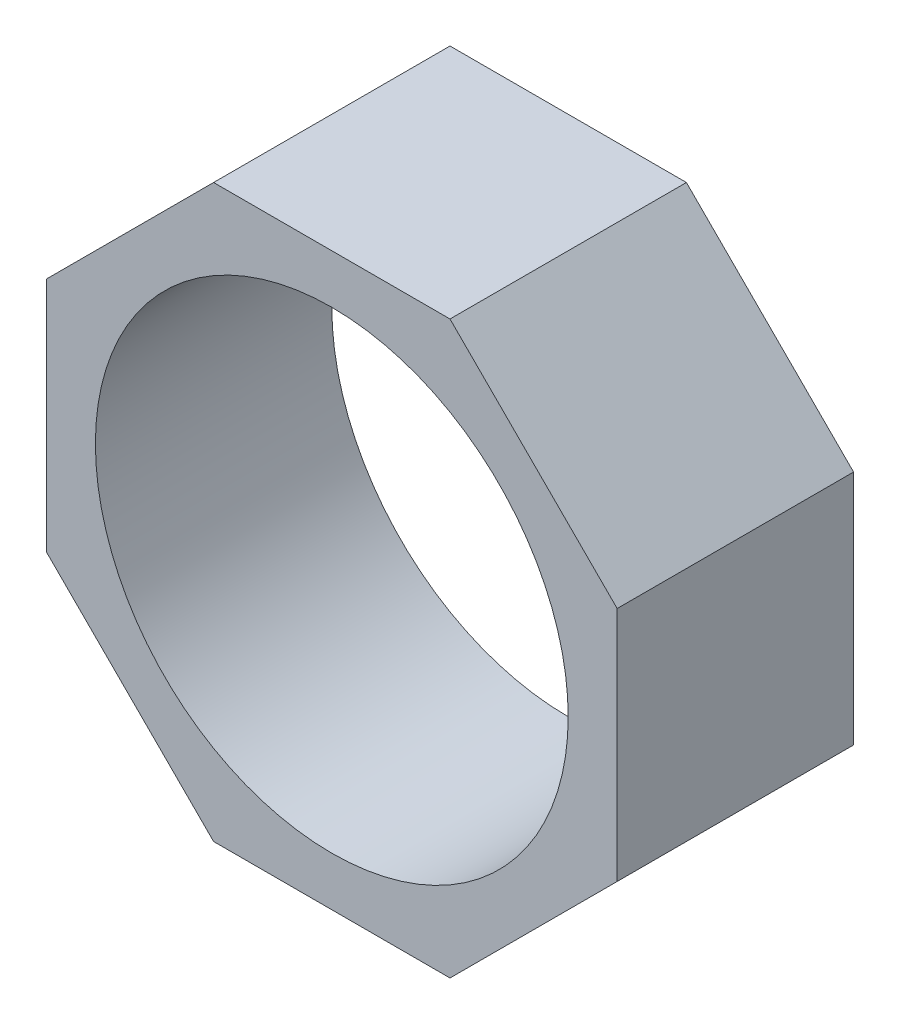
ISO-10303-21;
HEADER;
FILE_DESCRIPTION(('STEP AP214'),'2;1');
FILE_NAME('part.step','',(''),(''),'','','');
FILE_SCHEMA(('AUTOMOTIVE_DESIGN { 1 0 10303 214 1 1 1 1 }'));
ENDSEC;
DATA;
#1=APPLICATION_CONTEXT('core data for automotive mechanical design processes');
#2=APPLICATION_PROTOCOL_DEFINITION('international standard','automotive_design',2000,#1);
#3=PRODUCT_CONTEXT('',#1,'mechanical');
#4=PRODUCT('Part','Part','',(#3));
#5=PRODUCT_RELATED_PRODUCT_CATEGORY('part','',(#4));
#6=PRODUCT_DEFINITION_FORMATION('','',#4);
#7=PRODUCT_DEFINITION_CONTEXT('part definition',#1,'design');
#8=PRODUCT_DEFINITION('design','',#6,#7);
#9=PRODUCT_DEFINITION_SHAPE('','',#8);
#10=(LENGTH_UNIT() NAMED_UNIT(*) SI_UNIT(.MILLI.,.METRE.));
#11=(NAMED_UNIT(*) PLANE_ANGLE_UNIT() SI_UNIT($,.RADIAN.));
#12=(NAMED_UNIT(*) SI_UNIT($,.STERADIAN.) SOLID_ANGLE_UNIT());
#13=UNCERTAINTY_MEASURE_WITH_UNIT(LENGTH_MEASURE(1.E-05),#10,'distance_accuracy_value','');
#14=(GEOMETRIC_REPRESENTATION_CONTEXT(3) GLOBAL_UNCERTAINTY_ASSIGNED_CONTEXT((#13)) GLOBAL_UNIT_ASSIGNED_CONTEXT((#10,
#11,#12)) REPRESENTATION_CONTEXT('',''));
#15=CARTESIAN_POINT('',(0.,0.,0.));
#16=DIRECTION('',(0.,0.,1.));
#17=DIRECTION('',(1.,0.,0.));
#18=AXIS2_PLACEMENT_3D('',#15,#16,#17);
#19=CARTESIAN_POINT('',(0.,0.,2.5));
#20=DIRECTION('',(0.,0.,-1.));
#21=DIRECTION('',(-1.,0.,0.));
#22=AXIS2_PLACEMENT_3D('',#19,#20,#21);
#23=PLANE('',#22);
#24=DIRECTION('',(-0.707106781186548,-0.707106781186547,0.));
#25=VECTOR('',#24,1.);
#26=CARTESIAN_POINT('',(-3.01776695296637,1.25,2.5));
#27=LINE('',#26,#25);
#28=CARTESIAN_POINT('',(-1.25,3.01776695296637,2.5));
#29=VERTEX_POINT('',#28);
#30=CARTESIAN_POINT('',(-3.01776695296637,1.25,2.5));
#31=VERTEX_POINT('',#30);
#32=EDGE_CURVE('E149',#29,#31,#27,.T.);
#33=ORIENTED_EDGE('',*,*,#32,.T.);
#34=DIRECTION('',(0.,-1.,0.));
#35=VECTOR('',#34,1.);
#36=CARTESIAN_POINT('',(-3.01776695296637,-1.25,2.5));
#37=LINE('',#36,#35);
#38=CARTESIAN_POINT('',(-3.01776695296637,-1.25,2.5));
#39=VERTEX_POINT('',#38);
#40=EDGE_CURVE('E97',#31,#39,#37,.T.);
#41=ORIENTED_EDGE('',*,*,#40,.T.);
#42=DIRECTION('',(0.707106781186548,-0.707106781186547,0.));
#43=VECTOR('',#42,1.);
#44=CARTESIAN_POINT('',(-1.25,-3.01776695296637,2.5));
#45=LINE('',#44,#43);
#46=CARTESIAN_POINT('',(-1.25,-3.01776695296637,2.5));
#47=VERTEX_POINT('',#46);
#48=EDGE_CURVE('E164',#39,#47,#45,.T.);
#49=ORIENTED_EDGE('',*,*,#48,.T.);
#50=DIRECTION('',(1.,0.,0.));
#51=VECTOR('',#50,1.);
#52=CARTESIAN_POINT('',(1.25,-3.01776695296637,2.5));
#53=LINE('',#52,#51);
#54=CARTESIAN_POINT('',(1.25,-3.01776695296637,2.5));
#55=VERTEX_POINT('',#54);
#56=EDGE_CURVE('E177',#47,#55,#53,.T.);
#57=ORIENTED_EDGE('',*,*,#56,.T.);
#58=DIRECTION('',(0.707106781186548,0.707106781186547,0.));
#59=VECTOR('',#58,1.);
#60=CARTESIAN_POINT('',(3.01776695296637,-1.25,2.5));
#61=LINE('',#60,#59);
#62=CARTESIAN_POINT('',(3.01776695296637,-1.25,2.5));
#63=VERTEX_POINT('',#62);
#64=EDGE_CURVE('E116',#55,#63,#61,.T.);
#65=ORIENTED_EDGE('',*,*,#64,.T.);
#66=DIRECTION('',(0.,1.,0.));
#67=VECTOR('',#66,1.);
#68=CARTESIAN_POINT('',(3.01776695296637,1.25,2.5));
#69=LINE('',#68,#67);
#70=CARTESIAN_POINT('',(3.01776695296637,1.25,2.5));
#71=VERTEX_POINT('',#70);
#72=EDGE_CURVE('E110',#63,#71,#69,.T.);
#73=ORIENTED_EDGE('',*,*,#72,.T.);
#74=DIRECTION('',(-0.707106781186548,0.707106781186547,0.));
#75=VECTOR('',#74,1.);
#76=CARTESIAN_POINT('',(1.25,3.01776695296637,2.5));
#77=LINE('',#76,#75);
#78=CARTESIAN_POINT('',(1.25,3.01776695296637,2.5));
#79=VERTEX_POINT('',#78);
#80=EDGE_CURVE('E114',#71,#79,#77,.T.);
#81=ORIENTED_EDGE('',*,*,#80,.T.);
#82=DIRECTION('',(-1.,0.,0.));
#83=VECTOR('',#82,1.);
#84=CARTESIAN_POINT('',(-1.25,3.01776695296637,2.5));
#85=LINE('',#84,#83);
#86=EDGE_CURVE('E54',#79,#29,#85,.T.);
#87=ORIENTED_EDGE('',*,*,#86,.T.);
#88=EDGE_LOOP('',(#33,#41,#49,#57,#65,#73,#81,#87));
#89=FACE_BOUND('',#88,.T.);
#90=CARTESIAN_POINT('',(0.,0.,2.5));
#91=DIRECTION('',(0.,0.,1.));
#92=DIRECTION('',(1.,0.,0.));
#93=AXIS2_PLACEMENT_3D('',#90,#91,#92);
#94=CIRCLE('',#93,2.5);
#95=CARTESIAN_POINT('',(2.5,0.,2.5));
#96=VERTEX_POINT('',#95);
#97=EDGE_CURVE('E138',#96,#96,#94,.T.);
#98=ORIENTED_EDGE('',*,*,#97,.F.);
#99=EDGE_LOOP('',(#98));
#100=FACE_BOUND('',#99,.T.);
#101=ADVANCED_FACE('F37',(#89,#100),#23,.F.);
#102=CARTESIAN_POINT('',(0.,0.,0.));
#103=DIRECTION('',(0.,0.,-1.));
#104=DIRECTION('',(-1.,0.,0.));
#105=AXIS2_PLACEMENT_3D('',#102,#103,#104);
#106=PLANE('',#105);
#107=DIRECTION('',(-0.707106781186548,-0.707106781186547,0.));
#108=VECTOR('',#107,1.);
#109=CARTESIAN_POINT('',(-3.01776695296637,1.25,0.));
#110=LINE('',#109,#108);
#111=CARTESIAN_POINT('',(-1.25,3.01776695296637,0.));
#112=VERTEX_POINT('',#111);
#113=CARTESIAN_POINT('',(-3.01776695296637,1.25,0.));
#114=VERTEX_POINT('',#113);
#115=EDGE_CURVE('E134',#112,#114,#110,.T.);
#116=ORIENTED_EDGE('',*,*,#115,.F.);
#117=DIRECTION('',(-1.,0.,0.));
#118=VECTOR('',#117,1.);
#119=CARTESIAN_POINT('',(-1.25,3.01776695296637,0.));
#120=LINE('',#119,#118);
#121=CARTESIAN_POINT('',(1.25,3.01776695296637,0.));
#122=VERTEX_POINT('',#121);
#123=EDGE_CURVE('E89',#122,#112,#120,.T.);
#124=ORIENTED_EDGE('',*,*,#123,.F.);
#125=DIRECTION('',(-0.707106781186548,0.707106781186547,0.));
#126=VECTOR('',#125,1.);
#127=CARTESIAN_POINT('',(1.25,3.01776695296637,0.));
#128=LINE('',#127,#126);
#129=CARTESIAN_POINT('',(3.01776695296637,1.25,0.));
#130=VERTEX_POINT('',#129);
#131=EDGE_CURVE('E83',#130,#122,#128,.T.);
#132=ORIENTED_EDGE('',*,*,#131,.F.);
#133=DIRECTION('',(0.,1.,0.));
#134=VECTOR('',#133,1.);
#135=CARTESIAN_POINT('',(3.01776695296637,1.25,0.));
#136=LINE('',#135,#134);
#137=CARTESIAN_POINT('',(3.01776695296637,-1.25,0.));
#138=VERTEX_POINT('',#137);
#139=EDGE_CURVE('E124',#138,#130,#136,.T.);
#140=ORIENTED_EDGE('',*,*,#139,.F.);
#141=DIRECTION('',(0.707106781186548,0.707106781186547,0.));
#142=VECTOR('',#141,1.);
#143=CARTESIAN_POINT('',(3.01776695296637,-1.25,0.));
#144=LINE('',#143,#142);
#145=CARTESIAN_POINT('',(1.25,-3.01776695296637,0.));
#146=VERTEX_POINT('',#145);
#147=EDGE_CURVE('E144',#146,#138,#144,.T.);
#148=ORIENTED_EDGE('',*,*,#147,.F.);
#149=DIRECTION('',(1.,0.,0.));
#150=VECTOR('',#149,1.);
#151=CARTESIAN_POINT('',(1.25,-3.01776695296637,0.));
#152=LINE('',#151,#150);
#153=CARTESIAN_POINT('',(-1.25,-3.01776695296637,0.));
#154=VERTEX_POINT('',#153);
#155=EDGE_CURVE('E142',#154,#146,#152,.T.);
#156=ORIENTED_EDGE('',*,*,#155,.F.);
#157=DIRECTION('',(0.707106781186548,-0.707106781186547,0.));
#158=VECTOR('',#157,1.);
#159=CARTESIAN_POINT('',(-1.25,-3.01776695296637,0.));
#160=LINE('',#159,#158);
#161=CARTESIAN_POINT('',(-3.01776695296637,-1.25,0.));
#162=VERTEX_POINT('',#161);
#163=EDGE_CURVE('E140',#162,#154,#160,.T.);
#164=ORIENTED_EDGE('',*,*,#163,.F.);
#165=DIRECTION('',(0.,-1.,0.));
#166=VECTOR('',#165,1.);
#167=CARTESIAN_POINT('',(-3.01776695296637,-1.25,0.));
#168=LINE('',#167,#166);
#169=EDGE_CURVE('E137',#114,#162,#168,.T.);
#170=ORIENTED_EDGE('',*,*,#169,.F.);
#171=EDGE_LOOP('',(#116,#124,#132,#140,#148,#156,#164,#170));
#172=FACE_BOUND('',#171,.T.);
#173=CARTESIAN_POINT('',(0.,0.,0.));
#174=DIRECTION('',(0.,0.,1.));
#175=DIRECTION('',(1.,0.,0.));
#176=AXIS2_PLACEMENT_3D('',#173,#174,#175);
#177=CIRCLE('',#176,2.5);
#178=CARTESIAN_POINT('',(2.5,0.,0.));
#179=VERTEX_POINT('',#178);
#180=EDGE_CURVE('E183',#179,#179,#177,.T.);
#181=ORIENTED_EDGE('',*,*,#180,.T.);
#182=EDGE_LOOP('',(#181));
#183=FACE_BOUND('',#182,.T.);
#184=ADVANCED_FACE('F168',(#172,#183),#106,.T.);
#185=CARTESIAN_POINT('',(-3.01776695296637,1.25,2.5));
#186=DIRECTION('',(0.707106781186547,-0.707106781186548,0.));
#187=DIRECTION('',(0.707106781186548,0.707106781186547,0.));
#188=AXIS2_PLACEMENT_3D('',#185,#186,#187);
#189=PLANE('',#188);
#190=ORIENTED_EDGE('',*,*,#115,.T.);
#191=DIRECTION('',(0.,0.,-1.));
#192=VECTOR('',#191,1.);
#193=CARTESIAN_POINT('',(-3.01776695296637,1.25,2.5));
#194=LINE('',#193,#192);
#195=EDGE_CURVE('E11',#31,#114,#194,.T.);
#196=ORIENTED_EDGE('',*,*,#195,.F.);
#197=ORIENTED_EDGE('',*,*,#32,.F.);
#198=DIRECTION('',(0.,0.,-1.));
#199=VECTOR('',#198,1.);
#200=CARTESIAN_POINT('',(-1.25,3.01776695296637,2.5));
#201=LINE('',#200,#199);
#202=EDGE_CURVE('E130',#29,#112,#201,.T.);
#203=ORIENTED_EDGE('',*,*,#202,.T.);
#204=EDGE_LOOP('',(#190,#196,#197,#203));
#205=FACE_BOUND('',#204,.T.);
#206=ADVANCED_FACE('F39',(#205),#189,.F.);
#207=CARTESIAN_POINT('',(-3.01776695296637,-1.25,2.5));
#208=DIRECTION('',(1.,0.,0.));
#209=DIRECTION('',(0.,0.,-1.));
#210=AXIS2_PLACEMENT_3D('',#207,#208,#209);
#211=PLANE('',#210);
#212=ORIENTED_EDGE('',*,*,#169,.T.);
#213=DIRECTION('',(0.,0.,-1.));
#214=VECTOR('',#213,1.);
#215=CARTESIAN_POINT('',(-3.01776695296637,-1.25,2.5));
#216=LINE('',#215,#214);
#217=EDGE_CURVE('E46',#39,#162,#216,.T.);
#218=ORIENTED_EDGE('',*,*,#217,.F.);
#219=ORIENTED_EDGE('',*,*,#40,.F.);
#220=ORIENTED_EDGE('',*,*,#195,.T.);
#221=EDGE_LOOP('',(#212,#218,#219,#220));
#222=FACE_BOUND('',#221,.T.);
#223=ADVANCED_FACE('F211',(#222),#211,.F.);
#224=CARTESIAN_POINT('',(-1.25,-3.01776695296637,2.5));
#225=DIRECTION('',(0.707106781186547,0.707106781186548,0.));
#226=DIRECTION('',(-0.707106781186548,0.707106781186547,0.));
#227=AXIS2_PLACEMENT_3D('',#224,#225,#226);
#228=PLANE('',#227);
#229=ORIENTED_EDGE('',*,*,#163,.T.);
#230=DIRECTION('',(0.,0.,-1.));
#231=VECTOR('',#230,1.);
#232=CARTESIAN_POINT('',(-1.25,-3.01776695296637,2.5));
#233=LINE('',#232,#231);
#234=EDGE_CURVE('E156',#47,#154,#233,.T.);
#235=ORIENTED_EDGE('',*,*,#234,.F.);
#236=ORIENTED_EDGE('',*,*,#48,.F.);
#237=ORIENTED_EDGE('',*,*,#217,.T.);
#238=EDGE_LOOP('',(#229,#235,#236,#237));
#239=FACE_BOUND('',#238,.T.);
#240=ADVANCED_FACE('F162',(#239),#228,.F.);
#241=CARTESIAN_POINT('',(1.25,-3.01776695296637,2.5));
#242=DIRECTION('',(0.,1.,0.));
#243=DIRECTION('',(0.,0.,1.));
#244=AXIS2_PLACEMENT_3D('',#241,#242,#243);
#245=PLANE('',#244);
#246=ORIENTED_EDGE('',*,*,#155,.T.);
#247=DIRECTION('',(0.,0.,-1.));
#248=VECTOR('',#247,1.);
#249=CARTESIAN_POINT('',(1.25,-3.01776695296637,2.5));
#250=LINE('',#249,#248);
#251=EDGE_CURVE('E153',#55,#146,#250,.T.);
#252=ORIENTED_EDGE('',*,*,#251,.F.);
#253=ORIENTED_EDGE('',*,*,#56,.F.);
#254=ORIENTED_EDGE('',*,*,#234,.T.);
#255=EDGE_LOOP('',(#246,#252,#253,#254));
#256=FACE_BOUND('',#255,.T.);
#257=ADVANCED_FACE('F173',(#256),#245,.F.);
#258=CARTESIAN_POINT('',(3.01776695296637,-1.25,2.5));
#259=DIRECTION('',(-0.707106781186547,0.707106781186548,0.));
#260=DIRECTION('',(-0.707106781186548,-0.707106781186547,0.));
#261=AXIS2_PLACEMENT_3D('',#258,#259,#260);
#262=PLANE('',#261);
#263=ORIENTED_EDGE('',*,*,#147,.T.);
#264=DIRECTION('',(0.,0.,-1.));
#265=VECTOR('',#264,1.);
#266=CARTESIAN_POINT('',(3.01776695296637,-1.25,2.5));
#267=LINE('',#266,#265);
#268=EDGE_CURVE('E125',#63,#138,#267,.T.);
#269=ORIENTED_EDGE('',*,*,#268,.F.);
#270=ORIENTED_EDGE('',*,*,#64,.F.);
#271=ORIENTED_EDGE('',*,*,#251,.T.);
#272=EDGE_LOOP('',(#263,#269,#270,#271));
#273=FACE_BOUND('',#272,.T.);
#274=ADVANCED_FACE('F176',(#273),#262,.F.);
#275=CARTESIAN_POINT('',(3.01776695296637,1.25,2.5));
#276=DIRECTION('',(-1.,0.,0.));
#277=DIRECTION('',(0.,0.,1.));
#278=AXIS2_PLACEMENT_3D('',#275,#276,#277);
#279=PLANE('',#278);
#280=ORIENTED_EDGE('',*,*,#139,.T.);
#281=DIRECTION('',(0.,0.,-1.));
#282=VECTOR('',#281,1.);
#283=CARTESIAN_POINT('',(3.01776695296637,1.25,2.5));
#284=LINE('',#283,#282);
#285=EDGE_CURVE('E121',#71,#130,#284,.T.);
#286=ORIENTED_EDGE('',*,*,#285,.F.);
#287=ORIENTED_EDGE('',*,*,#72,.F.);
#288=ORIENTED_EDGE('',*,*,#268,.T.);
#289=EDGE_LOOP('',(#280,#286,#287,#288));
#290=FACE_BOUND('',#289,.T.);
#291=ADVANCED_FACE('F122',(#290),#279,.F.);
#292=CARTESIAN_POINT('',(1.25,3.01776695296637,2.5));
#293=DIRECTION('',(-0.707106781186547,-0.707106781186548,0.));
#294=DIRECTION('',(0.707106781186548,-0.707106781186547,0.));
#295=AXIS2_PLACEMENT_3D('',#292,#293,#294);
#296=PLANE('',#295);
#297=ORIENTED_EDGE('',*,*,#131,.T.);
#298=DIRECTION('',(0.,0.,-1.));
#299=VECTOR('',#298,1.);
#300=CARTESIAN_POINT('',(1.25,3.01776695296637,2.5));
#301=LINE('',#300,#299);
#302=EDGE_CURVE('E126',#79,#122,#301,.T.);
#303=ORIENTED_EDGE('',*,*,#302,.F.);
#304=ORIENTED_EDGE('',*,*,#80,.F.);
#305=ORIENTED_EDGE('',*,*,#285,.T.);
#306=EDGE_LOOP('',(#297,#303,#304,#305));
#307=FACE_BOUND('',#306,.T.);
#308=ADVANCED_FACE('F128',(#307),#296,.F.);
#309=CARTESIAN_POINT('',(-1.25,3.01776695296637,2.5));
#310=DIRECTION('',(0.,-1.,0.));
#311=DIRECTION('',(0.,0.,-1.));
#312=AXIS2_PLACEMENT_3D('',#309,#310,#311);
#313=PLANE('',#312);
#314=ORIENTED_EDGE('',*,*,#123,.T.);
#315=ORIENTED_EDGE('',*,*,#202,.F.);
#316=ORIENTED_EDGE('',*,*,#86,.F.);
#317=ORIENTED_EDGE('',*,*,#302,.T.);
#318=EDGE_LOOP('',(#314,#315,#316,#317));
#319=FACE_BOUND('',#318,.T.);
#320=ADVANCED_FACE('F199',(#319),#313,.F.);
#321=CARTESIAN_POINT('',(0.,0.,2.5));
#322=DIRECTION('',(0.,0.,-1.));
#323=DIRECTION('',(-1.,0.,0.));
#324=AXIS2_PLACEMENT_3D('',#321,#322,#323);
#325=CYLINDRICAL_SURFACE('',#324,2.5);
#326=ORIENTED_EDGE('',*,*,#97,.T.);
#327=EDGE_LOOP('',(#326));
#328=FACE_BOUND('',#327,.T.);
#329=ORIENTED_EDGE('',*,*,#180,.F.);
#330=EDGE_LOOP('',(#329));
#331=FACE_BOUND('',#330,.T.);
#332=ADVANCED_FACE('F189',(#328,#331),#325,.F.);
#333=CLOSED_SHELL('',(#101,#184,#206,#223,#240,#257,#274,#291,#308,#320,#332));
#334=MANIFOLD_SOLID_BREP('B2',#333);
#335=ADVANCED_BREP_SHAPE_REPRESENTATION('',(#18,#334),#14);
#336=SHAPE_DEFINITION_REPRESENTATION(#9,#335);
ENDSEC;
END-ISO-10303-21;
